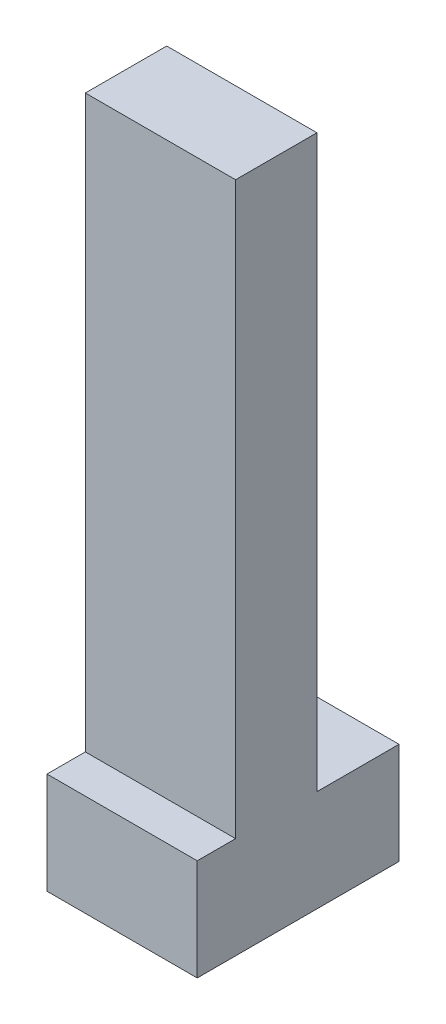
ISO-10303-21;
HEADER;
FILE_DESCRIPTION(('STEP AP214'),'2;1');
FILE_NAME('part.step','',(''),(''),'','','');
FILE_SCHEMA(('AUTOMOTIVE_DESIGN { 1 0 10303 214 1 1 1 1 }'));
ENDSEC;
DATA;
#1=APPLICATION_CONTEXT('core data for automotive mechanical design processes');
#2=APPLICATION_PROTOCOL_DEFINITION('international standard','automotive_design',2000,#1);
#3=PRODUCT_CONTEXT('',#1,'mechanical');
#4=PRODUCT('Part','Part','',(#3));
#5=PRODUCT_RELATED_PRODUCT_CATEGORY('part','',(#4));
#6=PRODUCT_DEFINITION_FORMATION('','',#4);
#7=PRODUCT_DEFINITION_CONTEXT('part definition',#1,'design');
#8=PRODUCT_DEFINITION('design','',#6,#7);
#9=PRODUCT_DEFINITION_SHAPE('','',#8);
#10=(LENGTH_UNIT() NAMED_UNIT(*) SI_UNIT(.MILLI.,.METRE.));
#11=(NAMED_UNIT(*) PLANE_ANGLE_UNIT() SI_UNIT($,.RADIAN.));
#12=(NAMED_UNIT(*) SI_UNIT($,.STERADIAN.) SOLID_ANGLE_UNIT());
#13=UNCERTAINTY_MEASURE_WITH_UNIT(LENGTH_MEASURE(1.E-05),#10,'distance_accuracy_value','');
#14=(GEOMETRIC_REPRESENTATION_CONTEXT(3) GLOBAL_UNCERTAINTY_ASSIGNED_CONTEXT((#13)) GLOBAL_UNIT_ASSIGNED_CONTEXT((#10,
#11,#12)) REPRESENTATION_CONTEXT('',''));
#15=CARTESIAN_POINT('',(0.,0.,0.));
#16=DIRECTION('',(0.,0.,1.));
#17=DIRECTION('',(1.,0.,0.));
#18=AXIS2_PLACEMENT_3D('',#15,#16,#17);
#19=CARTESIAN_POINT('',(11.,30.1169196142871,-11.5966540770529));
#20=DIRECTION('',(0.,-1.,0.));
#21=DIRECTION('',(0.,0.,-1.));
#22=AXIS2_PLACEMENT_3D('',#19,#20,#21);
#23=PLANE('',#22);
#24=DIRECTION('',(0.,0.,1.));
#25=VECTOR('',#24,1.);
#26=CARTESIAN_POINT('',(0.,30.1169196142871,-11.5966540770529));
#27=LINE('',#26,#25);
#28=CARTESIAN_POINT('',(0.,30.1169196142871,-11.5966540770529));
#29=VERTEX_POINT('',#28);
#30=CARTESIAN_POINT('',(0.,30.1169196142871,-5.63891260863247));
#31=VERTEX_POINT('',#30);
#32=EDGE_CURVE('E146',#29,#31,#27,.T.);
#33=ORIENTED_EDGE('',*,*,#32,.T.);
#34=DIRECTION('',(-1.,0.,0.));
#35=VECTOR('',#34,1.);
#36=CARTESIAN_POINT('',(11.,30.1169196142871,-5.63891260863247));
#37=LINE('',#36,#35);
#38=CARTESIAN_POINT('',(11.,30.1169196142871,-5.63891260863247));
#39=VERTEX_POINT('',#38);
#40=EDGE_CURVE('E11',#39,#31,#37,.T.);
#41=ORIENTED_EDGE('',*,*,#40,.F.);
#42=DIRECTION('',(0.,0.,1.));
#43=VECTOR('',#42,1.);
#44=CARTESIAN_POINT('',(11.,30.1169196142871,-11.5966540770529));
#45=LINE('',#44,#43);
#46=CARTESIAN_POINT('',(11.,30.1169196142871,-11.5966540770529));
#47=VERTEX_POINT('',#46);
#48=EDGE_CURVE('E168',#47,#39,#45,.T.);
#49=ORIENTED_EDGE('',*,*,#48,.F.);
#50=DIRECTION('',(-1.,0.,0.));
#51=VECTOR('',#50,1.);
#52=CARTESIAN_POINT('',(11.,30.1169196142871,-11.5966540770529));
#53=LINE('',#52,#51);
#54=EDGE_CURVE('E142',#47,#29,#53,.T.);
#55=ORIENTED_EDGE('',*,*,#54,.T.);
#56=EDGE_LOOP('',(#33,#41,#49,#55));
#57=FACE_BOUND('',#56,.T.);
#58=ADVANCED_FACE('F45',(#57),#23,.F.);
#59=CARTESIAN_POINT('',(11.,30.1169196142871,-5.63891260863247));
#60=DIRECTION('',(0.,0.,-1.));
#61=DIRECTION('',(-1.,0.,0.));
#62=AXIS2_PLACEMENT_3D('',#59,#60,#61);
#63=PLANE('',#62);
#64=DIRECTION('',(0.,-1.,0.));
#65=VECTOR('',#64,1.);
#66=CARTESIAN_POINT('',(0.,30.1169196142871,-5.63891260863247));
#67=LINE('',#66,#65);
#68=CARTESIAN_POINT('',(0.,-11.6622965314899,-5.63891260863247));
#69=VERTEX_POINT('',#68);
#70=EDGE_CURVE('E150',#31,#69,#67,.T.);
#71=ORIENTED_EDGE('',*,*,#70,.T.);
#72=DIRECTION('',(-1.,0.,0.));
#73=VECTOR('',#72,1.);
#74=CARTESIAN_POINT('',(11.,-11.6622965314899,-5.63891260863247));
#75=LINE('',#74,#73);
#76=CARTESIAN_POINT('',(11.,-11.6622965314899,-5.63891260863247));
#77=VERTEX_POINT('',#76);
#78=EDGE_CURVE('E54',#77,#69,#75,.T.);
#79=ORIENTED_EDGE('',*,*,#78,.F.);
#80=DIRECTION('',(0.,-1.,0.));
#81=VECTOR('',#80,1.);
#82=CARTESIAN_POINT('',(11.,30.1169196142871,-5.63891260863247));
#83=LINE('',#82,#81);
#84=EDGE_CURVE('E105',#39,#77,#83,.T.);
#85=ORIENTED_EDGE('',*,*,#84,.F.);
#86=ORIENTED_EDGE('',*,*,#40,.T.);
#87=EDGE_LOOP('',(#71,#79,#85,#86));
#88=FACE_BOUND('',#87,.T.);
#89=ADVANCED_FACE('F214',(#88),#63,.F.);
#90=CARTESIAN_POINT('',(11.,-11.6622965314899,-5.63891260863247));
#91=DIRECTION('',(0.,-1.,0.));
#92=DIRECTION('',(0.,0.,-1.));
#93=AXIS2_PLACEMENT_3D('',#90,#91,#92);
#94=PLANE('',#93);
#95=DIRECTION('',(0.,0.,1.));
#96=VECTOR('',#95,1.);
#97=CARTESIAN_POINT('',(0.,-11.6622965314899,-5.63891260863247));
#98=LINE('',#97,#96);
#99=CARTESIAN_POINT('',(0.,-11.6622965314899,-2.83186960196247));
#100=VERTEX_POINT('',#99);
#101=EDGE_CURVE('E153',#69,#100,#98,.T.);
#102=ORIENTED_EDGE('',*,*,#101,.T.);
#103=DIRECTION('',(-1.,0.,0.));
#104=VECTOR('',#103,1.);
#105=CARTESIAN_POINT('',(11.,-11.6622965314899,-2.83186960196247));
#106=LINE('',#105,#104);
#107=CARTESIAN_POINT('',(11.,-11.6622965314899,-2.83186960196247));
#108=VERTEX_POINT('',#107);
#109=EDGE_CURVE('E179',#108,#100,#106,.T.);
#110=ORIENTED_EDGE('',*,*,#109,.F.);
#111=DIRECTION('',(0.,0.,1.));
#112=VECTOR('',#111,1.);
#113=CARTESIAN_POINT('',(11.,-11.6622965314899,-5.63891260863247));
#114=LINE('',#113,#112);
#115=EDGE_CURVE('E189',#77,#108,#114,.T.);
#116=ORIENTED_EDGE('',*,*,#115,.F.);
#117=ORIENTED_EDGE('',*,*,#78,.T.);
#118=EDGE_LOOP('',(#102,#110,#116,#117));
#119=FACE_BOUND('',#118,.T.);
#120=ADVANCED_FACE('F187',(#119),#94,.F.);
#121=CARTESIAN_POINT('',(11.,-11.6622965314899,-2.83186960196247));
#122=DIRECTION('',(0.,0.,-1.));
#123=DIRECTION('',(0.,1.,0.));
#124=AXIS2_PLACEMENT_3D('',#121,#122,#123);
#125=PLANE('',#124);
#126=DIRECTION('',(0.,-1.,0.));
#127=VECTOR('',#126,1.);
#128=CARTESIAN_POINT('',(0.,-11.6622965314899,-2.83186960196247));
#129=LINE('',#128,#127);
#130=CARTESIAN_POINT('',(0.,-19.0954086065054,-2.83186960196247));
#131=VERTEX_POINT('',#130);
#132=EDGE_CURVE('E156',#100,#131,#129,.T.);
#133=ORIENTED_EDGE('',*,*,#132,.T.);
#134=DIRECTION('',(-1.,0.,0.));
#135=VECTOR('',#134,1.);
#136=CARTESIAN_POINT('',(11.,-19.0954086065054,-2.83186960196247));
#137=LINE('',#136,#135);
#138=CARTESIAN_POINT('',(11.,-19.0954086065054,-2.83186960196247));
#139=VERTEX_POINT('',#138);
#140=EDGE_CURVE('E175',#139,#131,#137,.T.);
#141=ORIENTED_EDGE('',*,*,#140,.F.);
#142=DIRECTION('',(0.,-1.,0.));
#143=VECTOR('',#142,1.);
#144=CARTESIAN_POINT('',(11.,-11.6622965314899,-2.83186960196247));
#145=LINE('',#144,#143);
#146=EDGE_CURVE('E202',#108,#139,#145,.T.);
#147=ORIENTED_EDGE('',*,*,#146,.F.);
#148=ORIENTED_EDGE('',*,*,#109,.T.);
#149=EDGE_LOOP('',(#133,#141,#147,#148));
#150=FACE_BOUND('',#149,.T.);
#151=ADVANCED_FACE('F197',(#150),#125,.F.);
#152=CARTESIAN_POINT('',(11.,-19.0954086065054,-2.83186960196247));
#153=DIRECTION('',(0.,1.,0.));
#154=DIRECTION('',(0.,0.,1.));
#155=AXIS2_PLACEMENT_3D('',#152,#153,#154);
#156=PLANE('',#155);
#157=DIRECTION('',(0.,0.,-1.));
#158=VECTOR('',#157,1.);
#159=CARTESIAN_POINT('',(0.,-19.0954086065054,-2.83186960196247));
#160=LINE('',#159,#158);
#161=CARTESIAN_POINT('',(0.,-19.0954086065054,-17.6041231833324));
#162=VERTEX_POINT('',#161);
#163=EDGE_CURVE('E159',#131,#162,#160,.T.);
#164=ORIENTED_EDGE('',*,*,#163,.T.);
#165=DIRECTION('',(-1.,0.,0.));
#166=VECTOR('',#165,1.);
#167=CARTESIAN_POINT('',(11.,-19.0954086065054,-17.6041231833324));
#168=LINE('',#167,#166);
#169=CARTESIAN_POINT('',(11.,-19.0954086065054,-17.6041231833324));
#170=VERTEX_POINT('',#169);
#171=EDGE_CURVE('E135',#170,#162,#168,.T.);
#172=ORIENTED_EDGE('',*,*,#171,.F.);
#173=DIRECTION('',(0.,0.,-1.));
#174=VECTOR('',#173,1.);
#175=CARTESIAN_POINT('',(11.,-19.0954086065054,-2.83186960196247));
#176=LINE('',#175,#174);
#177=EDGE_CURVE('E124',#139,#170,#176,.T.);
#178=ORIENTED_EDGE('',*,*,#177,.F.);
#179=ORIENTED_EDGE('',*,*,#140,.T.);
#180=EDGE_LOOP('',(#164,#172,#178,#179));
#181=FACE_BOUND('',#180,.T.);
#182=ADVANCED_FACE('F200',(#181),#156,.F.);
#183=CARTESIAN_POINT('',(11.,-19.0954086065054,-17.6041231833324));
#184=DIRECTION('',(0.,0.,1.));
#185=DIRECTION('',(1.,0.,0.));
#186=AXIS2_PLACEMENT_3D('',#183,#184,#185);
#187=PLANE('',#186);
#188=DIRECTION('',(0.,1.,0.));
#189=VECTOR('',#188,1.);
#190=CARTESIAN_POINT('',(0.,-19.0954086065054,-17.6041231833324));
#191=LINE('',#190,#189);
#192=CARTESIAN_POINT('',(0.,-11.6622965314899,-17.6041231833324));
#193=VERTEX_POINT('',#192);
#194=EDGE_CURVE('E133',#162,#193,#191,.T.);
#195=ORIENTED_EDGE('',*,*,#194,.T.);
#196=DIRECTION('',(-1.,0.,0.));
#197=VECTOR('',#196,1.);
#198=CARTESIAN_POINT('',(11.,-11.6622965314899,-17.6041231833324));
#199=LINE('',#198,#197);
#200=CARTESIAN_POINT('',(11.,-11.6622965314899,-17.6041231833324));
#201=VERTEX_POINT('',#200);
#202=EDGE_CURVE('E130',#201,#193,#199,.T.);
#203=ORIENTED_EDGE('',*,*,#202,.F.);
#204=DIRECTION('',(0.,1.,0.));
#205=VECTOR('',#204,1.);
#206=CARTESIAN_POINT('',(11.,-19.0954086065054,-17.6041231833324));
#207=LINE('',#206,#205);
#208=EDGE_CURVE('E118',#170,#201,#207,.T.);
#209=ORIENTED_EDGE('',*,*,#208,.F.);
#210=ORIENTED_EDGE('',*,*,#171,.T.);
#211=EDGE_LOOP('',(#195,#203,#209,#210));
#212=FACE_BOUND('',#211,.T.);
#213=ADVANCED_FACE('F131',(#212),#187,.F.);
#214=CARTESIAN_POINT('',(11.,-11.6622965314899,-17.6041231833324));
#215=DIRECTION('',(0.,-1.,0.));
#216=DIRECTION('',(0.,0.,-1.));
#217=AXIS2_PLACEMENT_3D('',#214,#215,#216);
#218=PLANE('',#217);
#219=DIRECTION('',(0.,0.,1.));
#220=VECTOR('',#219,1.);
#221=CARTESIAN_POINT('',(0.,-11.6622965314899,-17.6041231833324));
#222=LINE('',#221,#220);
#223=CARTESIAN_POINT('',(0.,-11.6622965314899,-11.5966540770529));
#224=VERTEX_POINT('',#223);
#225=EDGE_CURVE('E91',#193,#224,#222,.T.);
#226=ORIENTED_EDGE('',*,*,#225,.T.);
#227=DIRECTION('',(-1.,0.,0.));
#228=VECTOR('',#227,1.);
#229=CARTESIAN_POINT('',(11.,-11.6622965314899,-11.5966540770529));
#230=LINE('',#229,#228);
#231=CARTESIAN_POINT('',(11.,-11.6622965314899,-11.5966540770529));
#232=VERTEX_POINT('',#231);
#233=EDGE_CURVE('E136',#232,#224,#230,.T.);
#234=ORIENTED_EDGE('',*,*,#233,.F.);
#235=DIRECTION('',(0.,0.,1.));
#236=VECTOR('',#235,1.);
#237=CARTESIAN_POINT('',(11.,-11.6622965314899,-17.6041231833324));
#238=LINE('',#237,#236);
#239=EDGE_CURVE('E122',#201,#232,#238,.T.);
#240=ORIENTED_EDGE('',*,*,#239,.F.);
#241=ORIENTED_EDGE('',*,*,#202,.T.);
#242=EDGE_LOOP('',(#226,#234,#240,#241));
#243=FACE_BOUND('',#242,.T.);
#244=ADVANCED_FACE('F138',(#243),#218,.F.);
#245=CARTESIAN_POINT('',(11.,-11.6622965314899,-11.5966540770529));
#246=DIRECTION('',(0.,0.,1.));
#247=DIRECTION('',(1.,0.,0.));
#248=AXIS2_PLACEMENT_3D('',#245,#246,#247);
#249=PLANE('',#248);
#250=DIRECTION('',(0.,1.,0.));
#251=VECTOR('',#250,1.);
#252=CARTESIAN_POINT('',(0.,-11.6622965314899,-11.5966540770529));
#253=LINE('',#252,#251);
#254=EDGE_CURVE('E97',#224,#29,#253,.T.);
#255=ORIENTED_EDGE('',*,*,#254,.T.);
#256=ORIENTED_EDGE('',*,*,#54,.F.);
#257=DIRECTION('',(0.,1.,0.));
#258=VECTOR('',#257,1.);
#259=CARTESIAN_POINT('',(11.,-11.6622965314899,-11.5966540770529));
#260=LINE('',#259,#258);
#261=EDGE_CURVE('E62',#232,#47,#260,.T.);
#262=ORIENTED_EDGE('',*,*,#261,.F.);
#263=ORIENTED_EDGE('',*,*,#233,.T.);
#264=EDGE_LOOP('',(#255,#256,#262,#263));
#265=FACE_BOUND('',#264,.T.);
#266=ADVANCED_FACE('F230',(#265),#249,.F.);
#267=CARTESIAN_POINT('',(11.,0.,0.));
#268=DIRECTION('',(1.,0.,0.));
#269=DIRECTION('',(0.,0.,-1.));
#270=AXIS2_PLACEMENT_3D('',#267,#268,#269);
#271=PLANE('',#270);
#272=ORIENTED_EDGE('',*,*,#48,.T.);
#273=ORIENTED_EDGE('',*,*,#84,.T.);
#274=ORIENTED_EDGE('',*,*,#115,.T.);
#275=ORIENTED_EDGE('',*,*,#146,.T.);
#276=ORIENTED_EDGE('',*,*,#177,.T.);
#277=ORIENTED_EDGE('',*,*,#208,.T.);
#278=ORIENTED_EDGE('',*,*,#239,.T.);
#279=ORIENTED_EDGE('',*,*,#261,.T.);
#280=EDGE_LOOP('',(#272,#273,#274,#275,#276,#277,#278,#279));
#281=FACE_BOUND('',#280,.T.);
#282=ADVANCED_FACE('F120',(#281),#271,.T.);
#283=CARTESIAN_POINT('',(0.,0.,0.));
#284=DIRECTION('',(1.,0.,0.));
#285=DIRECTION('',(0.,0.,-1.));
#286=AXIS2_PLACEMENT_3D('',#283,#284,#285);
#287=PLANE('',#286);
#288=ORIENTED_EDGE('',*,*,#32,.F.);
#289=ORIENTED_EDGE('',*,*,#254,.F.);
#290=ORIENTED_EDGE('',*,*,#225,.F.);
#291=ORIENTED_EDGE('',*,*,#194,.F.);
#292=ORIENTED_EDGE('',*,*,#163,.F.);
#293=ORIENTED_EDGE('',*,*,#132,.F.);
#294=ORIENTED_EDGE('',*,*,#101,.F.);
#295=ORIENTED_EDGE('',*,*,#70,.F.);
#296=EDGE_LOOP('',(#288,#289,#290,#291,#292,#293,#294,#295));
#297=FACE_BOUND('',#296,.T.);
#298=ADVANCED_FACE('F193',(#297),#287,.F.);
#299=CLOSED_SHELL('',(#58,#89,#120,#151,#182,#213,#244,#266,#282,#298));
#300=MANIFOLD_SOLID_BREP('B2',#299);
#301=ADVANCED_BREP_SHAPE_REPRESENTATION('',(#18,#300),#14);
#302=SHAPE_DEFINITION_REPRESENTATION(#9,#301);
ENDSEC;
END-ISO-10303-21;
